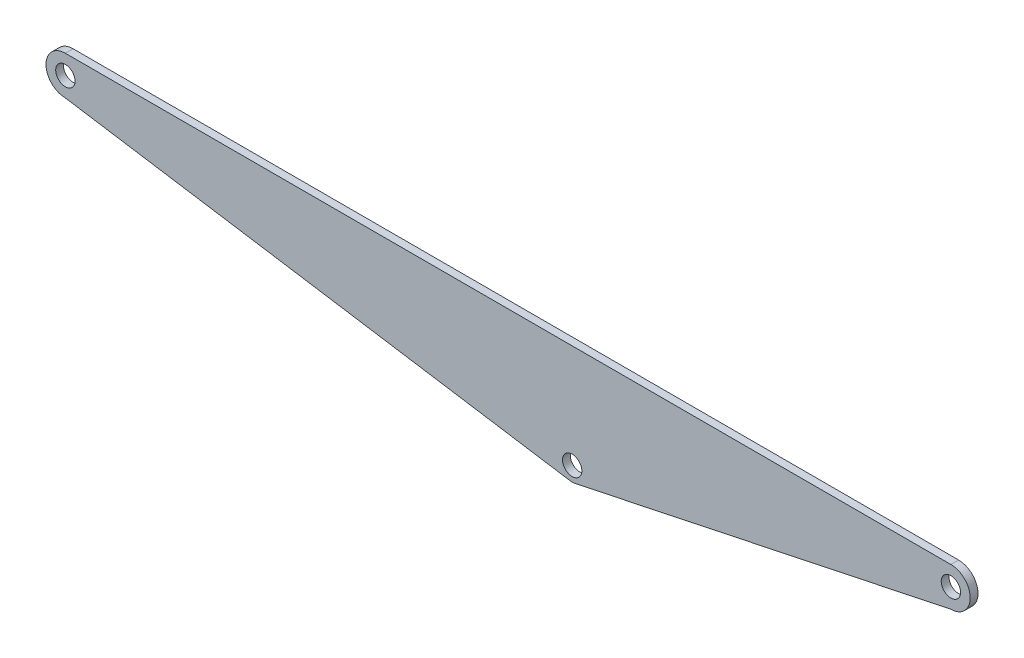
ISO-10303-21;
HEADER;
FILE_DESCRIPTION(('STEP AP214'),'2;1');
FILE_NAME('part.step','',(''),(''),'','','');
FILE_SCHEMA(('AUTOMOTIVE_DESIGN { 1 0 10303 214 1 1 1 1 }'));
ENDSEC;
DATA;
#1=APPLICATION_CONTEXT('core data for automotive mechanical design processes');
#2=APPLICATION_PROTOCOL_DEFINITION('international standard','automotive_design',2000,#1);
#3=PRODUCT_CONTEXT('',#1,'mechanical');
#4=PRODUCT('Part','Part','',(#3));
#5=PRODUCT_RELATED_PRODUCT_CATEGORY('part','',(#4));
#6=PRODUCT_DEFINITION_FORMATION('','',#4);
#7=PRODUCT_DEFINITION_CONTEXT('part definition',#1,'design');
#8=PRODUCT_DEFINITION('design','',#6,#7);
#9=PRODUCT_DEFINITION_SHAPE('','',#8);
#10=(LENGTH_UNIT() NAMED_UNIT(*) SI_UNIT(.MILLI.,.METRE.));
#11=(NAMED_UNIT(*) PLANE_ANGLE_UNIT() SI_UNIT($,.RADIAN.));
#12=(NAMED_UNIT(*) SI_UNIT($,.STERADIAN.) SOLID_ANGLE_UNIT());
#13=UNCERTAINTY_MEASURE_WITH_UNIT(LENGTH_MEASURE(1.E-05),#10,'distance_accuracy_value','');
#14=(GEOMETRIC_REPRESENTATION_CONTEXT(3) GLOBAL_UNCERTAINTY_ASSIGNED_CONTEXT((#13)) GLOBAL_UNIT_ASSIGNED_CONTEXT((#10,
#11,#12)) REPRESENTATION_CONTEXT('',''));
#15=CARTESIAN_POINT('',(0.,0.,0.));
#16=DIRECTION('',(0.,0.,1.));
#17=DIRECTION('',(1.,0.,0.));
#18=AXIS2_PLACEMENT_3D('',#15,#16,#17);
#19=CARTESIAN_POINT('',(-580.7,0.,-5.08));
#20=DIRECTION('',(0.,0.,1.));
#21=DIRECTION('',(1.,0.,0.));
#22=AXIS2_PLACEMENT_3D('',#19,#20,#21);
#23=CYLINDRICAL_SURFACE('',#22,12.7);
#24=CARTESIAN_POINT('',(-580.7,0.,0.));
#25=DIRECTION('',(0.,0.,1.));
#26=DIRECTION('',(1.,0.,0.));
#27=AXIS2_PLACEMENT_3D('',#24,#25,#26);
#28=CIRCLE('',#27,12.7);
#29=CARTESIAN_POINT('',(-580.7,12.7,0.));
#30=VERTEX_POINT('',#29);
#31=CARTESIAN_POINT('',(-580.7,-12.7,0.));
#32=VERTEX_POINT('',#31);
#33=EDGE_CURVE('E135',#30,#32,#28,.T.);
#34=ORIENTED_EDGE('',*,*,#33,.F.);
#35=DIRECTION('',(0.,0.,1.));
#36=VECTOR('',#35,1.);
#37=CARTESIAN_POINT('',(-580.7,12.7,-5.08));
#38=LINE('',#37,#36);
#39=CARTESIAN_POINT('',(-580.7,12.7,-5.08));
#40=VERTEX_POINT('',#39);
#41=EDGE_CURVE('E11',#40,#30,#38,.T.);
#42=ORIENTED_EDGE('',*,*,#41,.F.);
#43=CARTESIAN_POINT('',(-580.7,0.,-5.08));
#44=DIRECTION('',(0.,0.,1.));
#45=DIRECTION('',(1.,0.,0.));
#46=AXIS2_PLACEMENT_3D('',#43,#44,#45);
#47=CIRCLE('',#46,12.7);
#48=CARTESIAN_POINT('',(-580.7,-12.7,-5.08));
#49=VERTEX_POINT('',#48);
#50=EDGE_CURVE('E156',#40,#49,#47,.T.);
#51=ORIENTED_EDGE('',*,*,#50,.T.);
#52=DIRECTION('',(0.,0.,1.));
#53=VECTOR('',#52,1.);
#54=CARTESIAN_POINT('',(-580.7,-12.7,-5.08));
#55=LINE('',#54,#53);
#56=EDGE_CURVE('E47',#49,#32,#55,.T.);
#57=ORIENTED_EDGE('',*,*,#56,.T.);
#58=EDGE_LOOP('',(#34,#42,#51,#57));
#59=FACE_BOUND('',#58,.T.);
#60=ADVANCED_FACE('F44',(#59),#23,.T.);
#61=CARTESIAN_POINT('',(-580.7,12.7,-5.08));
#62=DIRECTION('',(0.,1.,0.));
#63=DIRECTION('',(0.,0.,1.));
#64=AXIS2_PLACEMENT_3D('',#61,#62,#63);
#65=PLANE('',#64);
#66=DIRECTION('',(-1.,0.,0.));
#67=VECTOR('',#66,1.);
#68=CARTESIAN_POINT('',(-580.7,12.7,0.));
#69=LINE('',#68,#67);
#70=CARTESIAN_POINT('',(0.,12.7,0.));
#71=VERTEX_POINT('',#70);
#72=EDGE_CURVE('E153',#71,#30,#69,.T.);
#73=ORIENTED_EDGE('',*,*,#72,.F.);
#74=DIRECTION('',(0.,0.,1.));
#75=VECTOR('',#74,1.);
#76=CARTESIAN_POINT('',(0.,12.7,-5.08));
#77=LINE('',#76,#75);
#78=CARTESIAN_POINT('',(0.,12.7,-5.08));
#79=VERTEX_POINT('',#78);
#80=EDGE_CURVE('E54',#79,#71,#77,.T.);
#81=ORIENTED_EDGE('',*,*,#80,.F.);
#82=DIRECTION('',(-1.,0.,0.));
#83=VECTOR('',#82,1.);
#84=CARTESIAN_POINT('',(-580.7,12.7,-5.08));
#85=LINE('',#84,#83);
#86=EDGE_CURVE('E121',#79,#40,#85,.T.);
#87=ORIENTED_EDGE('',*,*,#86,.T.);
#88=ORIENTED_EDGE('',*,*,#41,.T.);
#89=EDGE_LOOP('',(#73,#81,#87,#88));
#90=FACE_BOUND('',#89,.T.);
#91=ADVANCED_FACE('F168',(#90),#65,.T.);
#92=CARTESIAN_POINT('',(0.,0.,-5.08));
#93=DIRECTION('',(0.,0.,1.));
#94=DIRECTION('',(1.,0.,0.));
#95=AXIS2_PLACEMENT_3D('',#92,#93,#94);
#96=CYLINDRICAL_SURFACE('',#95,12.7);
#97=CARTESIAN_POINT('',(0.,0.,0.));
#98=DIRECTION('',(0.,0.,1.));
#99=DIRECTION('',(-1.,0.,0.));
#100=AXIS2_PLACEMENT_3D('',#97,#98,#99);
#101=CIRCLE('',#100,12.7);
#102=CARTESIAN_POINT('',(0.,-12.7,0.));
#103=VERTEX_POINT('',#102);
#104=EDGE_CURVE('E107',#103,#71,#101,.T.);
#105=ORIENTED_EDGE('',*,*,#104,.F.);
#106=DIRECTION('',(0.,0.,1.));
#107=VECTOR('',#106,1.);
#108=CARTESIAN_POINT('',(0.,-12.7,-5.08));
#109=LINE('',#108,#107);
#110=CARTESIAN_POINT('',(0.,-12.7,-5.08));
#111=VERTEX_POINT('',#110);
#112=EDGE_CURVE('E102',#111,#103,#109,.T.);
#113=ORIENTED_EDGE('',*,*,#112,.F.);
#114=CARTESIAN_POINT('',(0.,0.,-5.08));
#115=DIRECTION('',(0.,0.,1.));
#116=DIRECTION('',(-1.,0.,0.));
#117=AXIS2_PLACEMENT_3D('',#114,#115,#116);
#118=CIRCLE('',#117,12.7);
#119=EDGE_CURVE('E105',#111,#79,#118,.T.);
#120=ORIENTED_EDGE('',*,*,#119,.T.);
#121=ORIENTED_EDGE('',*,*,#80,.T.);
#122=EDGE_LOOP('',(#105,#113,#120,#121));
#123=FACE_BOUND('',#122,.T.);
#124=ADVANCED_FACE('F104',(#123),#96,.T.);
#125=CARTESIAN_POINT('',(0.,-12.7,-5.08));
#126=DIRECTION('',(0.205686230695233,-0.978617992120719,0.));
#127=DIRECTION('',(0.978617992120719,0.205686230695233,0.));
#128=AXIS2_PLACEMENT_3D('',#125,#126,#127);
#129=PLANE('',#128);
#130=DIRECTION('',(0.978617992120719,0.205686230695233,0.));
#131=VECTOR('',#130,1.);
#132=CARTESIAN_POINT('',(0.,-12.7,0.));
#133=LINE('',#132,#131);
#134=CARTESIAN_POINT('',(-246.387841786122,-64.4858723977651,0.));
#135=VERTEX_POINT('',#134);
#136=EDGE_CURVE('E148',#135,#103,#133,.T.);
#137=ORIENTED_EDGE('',*,*,#136,.F.);
#138=DIRECTION('',(0.,0.,1.));
#139=VECTOR('',#138,1.);
#140=CARTESIAN_POINT('',(-246.387841786122,-64.4858723977651,-5.08));
#141=LINE('',#140,#139);
#142=CARTESIAN_POINT('',(-246.387841786122,-64.4858723977651,-5.08));
#143=VERTEX_POINT('',#142);
#144=EDGE_CURVE('E113',#143,#135,#141,.T.);
#145=ORIENTED_EDGE('',*,*,#144,.F.);
#146=DIRECTION('',(0.978617992120719,0.205686230695233,0.));
#147=VECTOR('',#146,1.);
#148=CARTESIAN_POINT('',(0.,-12.7,-5.08));
#149=LINE('',#148,#147);
#150=EDGE_CURVE('E119',#143,#111,#149,.T.);
#151=ORIENTED_EDGE('',*,*,#150,.T.);
#152=ORIENTED_EDGE('',*,*,#112,.T.);
#153=EDGE_LOOP('',(#137,#145,#151,#152));
#154=FACE_BOUND('',#153,.T.);
#155=ADVANCED_FACE('F124',(#154),#129,.T.);
#156=CARTESIAN_POINT('',(-248.347003133494,-55.1645360228153,-5.08));
#157=DIRECTION('',(0.,0.,1.));
#158=DIRECTION('',(1.,0.,0.));
#159=AXIS2_PLACEMENT_3D('',#156,#157,#158);
#160=CYLINDRICAL_SURFACE('',#159,9.52500000000001);
#161=CARTESIAN_POINT('',(-248.347003133494,-55.1645360228153,0.));
#162=DIRECTION('',(0.,0.,1.));
#163=DIRECTION('',(1.,0.,0.));
#164=AXIS2_PLACEMENT_3D('',#161,#162,#163);
#165=CIRCLE('',#164,9.52500000000001);
#166=CARTESIAN_POINT('',(-249.822299660695,-64.5745904943275,0.));
#167=VERTEX_POINT('',#166);
#168=EDGE_CURVE('E144',#167,#135,#165,.T.);
#169=ORIENTED_EDGE('',*,*,#168,.F.);
#170=DIRECTION('',(0.,0.,1.));
#171=VECTOR('',#170,1.);
#172=CARTESIAN_POINT('',(-249.822299660695,-64.5745904943275,-5.08));
#173=LINE('',#172,#171);
#174=CARTESIAN_POINT('',(-249.822299660695,-64.5745904943275,-5.08));
#175=VERTEX_POINT('',#174);
#176=EDGE_CURVE('E161',#175,#167,#173,.T.);
#177=ORIENTED_EDGE('',*,*,#176,.F.);
#178=CARTESIAN_POINT('',(-248.347003133494,-55.1645360228153,-5.08));
#179=DIRECTION('',(0.,0.,1.));
#180=DIRECTION('',(1.,0.,0.));
#181=AXIS2_PLACEMENT_3D('',#178,#179,#180);
#182=CIRCLE('',#181,9.52500000000001);
#183=EDGE_CURVE('E126',#175,#143,#182,.T.);
#184=ORIENTED_EDGE('',*,*,#183,.T.);
#185=ORIENTED_EDGE('',*,*,#144,.T.);
#186=EDGE_LOOP('',(#169,#177,#184,#185));
#187=FACE_BOUND('',#186,.T.);
#188=ADVANCED_FACE('F181',(#187),#160,.T.);
#189=CARTESIAN_POINT('',(-580.7,-12.7,-5.08));
#190=DIRECTION('',(-0.154886774509349,-0.987932227980285,0.));
#191=DIRECTION('',(0.987932227980285,-0.154886774509349,0.));
#192=AXIS2_PLACEMENT_3D('',#189,#190,#191);
#193=PLANE('',#192);
#194=DIRECTION('',(0.987932227980285,-0.154886774509349,0.));
#195=VECTOR('',#194,1.);
#196=CARTESIAN_POINT('',(-580.7,-12.7,0.));
#197=LINE('',#196,#195);
#198=EDGE_CURVE('E139',#32,#167,#197,.T.);
#199=ORIENTED_EDGE('',*,*,#198,.F.);
#200=ORIENTED_EDGE('',*,*,#56,.F.);
#201=DIRECTION('',(0.987932227980285,-0.154886774509349,0.));
#202=VECTOR('',#201,1.);
#203=CARTESIAN_POINT('',(-580.7,-12.7,-5.08));
#204=LINE('',#203,#202);
#205=EDGE_CURVE('E129',#49,#175,#204,.T.);
#206=ORIENTED_EDGE('',*,*,#205,.T.);
#207=ORIENTED_EDGE('',*,*,#176,.T.);
#208=EDGE_LOOP('',(#199,#200,#206,#207));
#209=FACE_BOUND('',#208,.T.);
#210=ADVANCED_FACE('F165',(#209),#193,.T.);
#211=CARTESIAN_POINT('',(-580.7,0.,-5.08));
#212=DIRECTION('',(0.,0.,1.));
#213=DIRECTION('',(1.,0.,0.));
#214=AXIS2_PLACEMENT_3D('',#211,#212,#213);
#215=PLANE('',#214);
#216=CARTESIAN_POINT('',(-248.347003133494,-55.1645360228153,-5.08));
#217=DIRECTION('',(0.,0.,1.));
#218=DIRECTION('',(1.,0.,0.));
#219=AXIS2_PLACEMENT_3D('',#216,#217,#218);
#220=CIRCLE('',#219,6.35);
#221=CARTESIAN_POINT('',(-241.997003133494,-55.1645360228153,-5.08));
#222=VERTEX_POINT('',#221);
#223=EDGE_CURVE('E211',#222,#222,#220,.T.);
#224=ORIENTED_EDGE('',*,*,#223,.T.);
#225=EDGE_LOOP('',(#224));
#226=FACE_BOUND('',#225,.T.);
#227=CARTESIAN_POINT('',(-580.7,0.,-5.08));
#228=DIRECTION('',(0.,0.,1.));
#229=DIRECTION('',(1.,0.,0.));
#230=AXIS2_PLACEMENT_3D('',#227,#228,#229);
#231=CIRCLE('',#230,6.34999999999994);
#232=CARTESIAN_POINT('',(-574.35,0.,-5.08));
#233=VERTEX_POINT('',#232);
#234=EDGE_CURVE('E221',#233,#233,#231,.T.);
#235=ORIENTED_EDGE('',*,*,#234,.T.);
#236=EDGE_LOOP('',(#235));
#237=FACE_BOUND('',#236,.T.);
#238=CARTESIAN_POINT('',(0.,0.,-5.08));
#239=DIRECTION('',(0.,0.,1.));
#240=DIRECTION('',(1.,0.,0.));
#241=AXIS2_PLACEMENT_3D('',#238,#239,#240);
#242=CIRCLE('',#241,6.35);
#243=CARTESIAN_POINT('',(6.35,0.,-5.08));
#244=VERTEX_POINT('',#243);
#245=EDGE_CURVE('E140',#244,#244,#242,.T.);
#246=ORIENTED_EDGE('',*,*,#245,.T.);
#247=EDGE_LOOP('',(#246));
#248=FACE_BOUND('',#247,.T.);
#249=ORIENTED_EDGE('',*,*,#50,.F.);
#250=ORIENTED_EDGE('',*,*,#86,.F.);
#251=ORIENTED_EDGE('',*,*,#119,.F.);
#252=ORIENTED_EDGE('',*,*,#150,.F.);
#253=ORIENTED_EDGE('',*,*,#183,.F.);
#254=ORIENTED_EDGE('',*,*,#205,.F.);
#255=EDGE_LOOP('',(#249,#250,#251,#252,#253,#254));
#256=FACE_BOUND('',#255,.T.);
#257=ADVANCED_FACE('F117',(#226,#237,#248,#256),#215,.F.);
#258=CARTESIAN_POINT('',(-580.7,0.,0.));
#259=DIRECTION('',(0.,0.,1.));
#260=DIRECTION('',(1.,0.,0.));
#261=AXIS2_PLACEMENT_3D('',#258,#259,#260);
#262=PLANE('',#261);
#263=CARTESIAN_POINT('',(-248.347003133494,-55.1645360228153,0.));
#264=DIRECTION('',(0.,0.,1.));
#265=DIRECTION('',(1.,0.,0.));
#266=AXIS2_PLACEMENT_3D('',#263,#264,#265);
#267=CIRCLE('',#266,6.35);
#268=CARTESIAN_POINT('',(-241.997003133494,-55.1645360228153,0.));
#269=VERTEX_POINT('',#268);
#270=EDGE_CURVE('E214',#269,#269,#267,.T.);
#271=ORIENTED_EDGE('',*,*,#270,.F.);
#272=EDGE_LOOP('',(#271));
#273=FACE_BOUND('',#272,.T.);
#274=CARTESIAN_POINT('',(-580.7,0.,0.));
#275=DIRECTION('',(0.,0.,1.));
#276=DIRECTION('',(1.,0.,0.));
#277=AXIS2_PLACEMENT_3D('',#274,#275,#276);
#278=CIRCLE('',#277,6.34999999999994);
#279=CARTESIAN_POINT('',(-574.35,0.,0.));
#280=VERTEX_POINT('',#279);
#281=EDGE_CURVE('E218',#280,#280,#278,.T.);
#282=ORIENTED_EDGE('',*,*,#281,.F.);
#283=EDGE_LOOP('',(#282));
#284=FACE_BOUND('',#283,.T.);
#285=CARTESIAN_POINT('',(0.,0.,0.));
#286=DIRECTION('',(0.,0.,1.));
#287=DIRECTION('',(1.,0.,0.));
#288=AXIS2_PLACEMENT_3D('',#285,#286,#287);
#289=CIRCLE('',#288,6.35);
#290=CARTESIAN_POINT('',(6.35,0.,0.));
#291=VERTEX_POINT('',#290);
#292=EDGE_CURVE('E225',#291,#291,#289,.T.);
#293=ORIENTED_EDGE('',*,*,#292,.F.);
#294=EDGE_LOOP('',(#293));
#295=FACE_BOUND('',#294,.T.);
#296=ORIENTED_EDGE('',*,*,#33,.T.);
#297=ORIENTED_EDGE('',*,*,#198,.T.);
#298=ORIENTED_EDGE('',*,*,#168,.T.);
#299=ORIENTED_EDGE('',*,*,#136,.T.);
#300=ORIENTED_EDGE('',*,*,#104,.T.);
#301=ORIENTED_EDGE('',*,*,#72,.T.);
#302=EDGE_LOOP('',(#296,#297,#298,#299,#300,#301));
#303=FACE_BOUND('',#302,.T.);
#304=ADVANCED_FACE('F167',(#273,#284,#295,#303),#262,.T.);
#305=CARTESIAN_POINT('',(0.,0.,-5.08));
#306=DIRECTION('',(0.,0.,1.));
#307=DIRECTION('',(1.,0.,0.));
#308=AXIS2_PLACEMENT_3D('',#305,#306,#307);
#309=CYLINDRICAL_SURFACE('',#308,6.35);
#310=ORIENTED_EDGE('',*,*,#245,.F.);
#311=EDGE_LOOP('',(#310));
#312=FACE_BOUND('',#311,.T.);
#313=ORIENTED_EDGE('',*,*,#292,.T.);
#314=EDGE_LOOP('',(#313));
#315=FACE_BOUND('',#314,.T.);
#316=ADVANCED_FACE('F192',(#312,#315),#309,.F.);
#317=CARTESIAN_POINT('',(-580.7,0.,-5.08));
#318=DIRECTION('',(0.,0.,1.));
#319=DIRECTION('',(1.,0.,0.));
#320=AXIS2_PLACEMENT_3D('',#317,#318,#319);
#321=CYLINDRICAL_SURFACE('',#320,6.34999999999994);
#322=ORIENTED_EDGE('',*,*,#234,.F.);
#323=EDGE_LOOP('',(#322));
#324=FACE_BOUND('',#323,.T.);
#325=ORIENTED_EDGE('',*,*,#281,.T.);
#326=EDGE_LOOP('',(#325));
#327=FACE_BOUND('',#326,.T.);
#328=ADVANCED_FACE('F199',(#324,#327),#321,.F.);
#329=CARTESIAN_POINT('',(-248.347003133494,-55.1645360228153,-5.08));
#330=DIRECTION('',(0.,0.,1.));
#331=DIRECTION('',(1.,0.,0.));
#332=AXIS2_PLACEMENT_3D('',#329,#330,#331);
#333=CYLINDRICAL_SURFACE('',#332,6.35);
#334=ORIENTED_EDGE('',*,*,#223,.F.);
#335=EDGE_LOOP('',(#334));
#336=FACE_BOUND('',#335,.T.);
#337=ORIENTED_EDGE('',*,*,#270,.T.);
#338=EDGE_LOOP('',(#337));
#339=FACE_BOUND('',#338,.T.);
#340=ADVANCED_FACE('F203',(#336,#339),#333,.F.);
#341=CLOSED_SHELL('',(#60,#91,#124,#155,#188,#210,#257,#304,#316,#328,#340));
#342=MANIFOLD_SOLID_BREP('B2',#341);
#343=ADVANCED_BREP_SHAPE_REPRESENTATION('',(#18,#342),#14);
#344=SHAPE_DEFINITION_REPRESENTATION(#9,#343);
ENDSEC;
END-ISO-10303-21;
